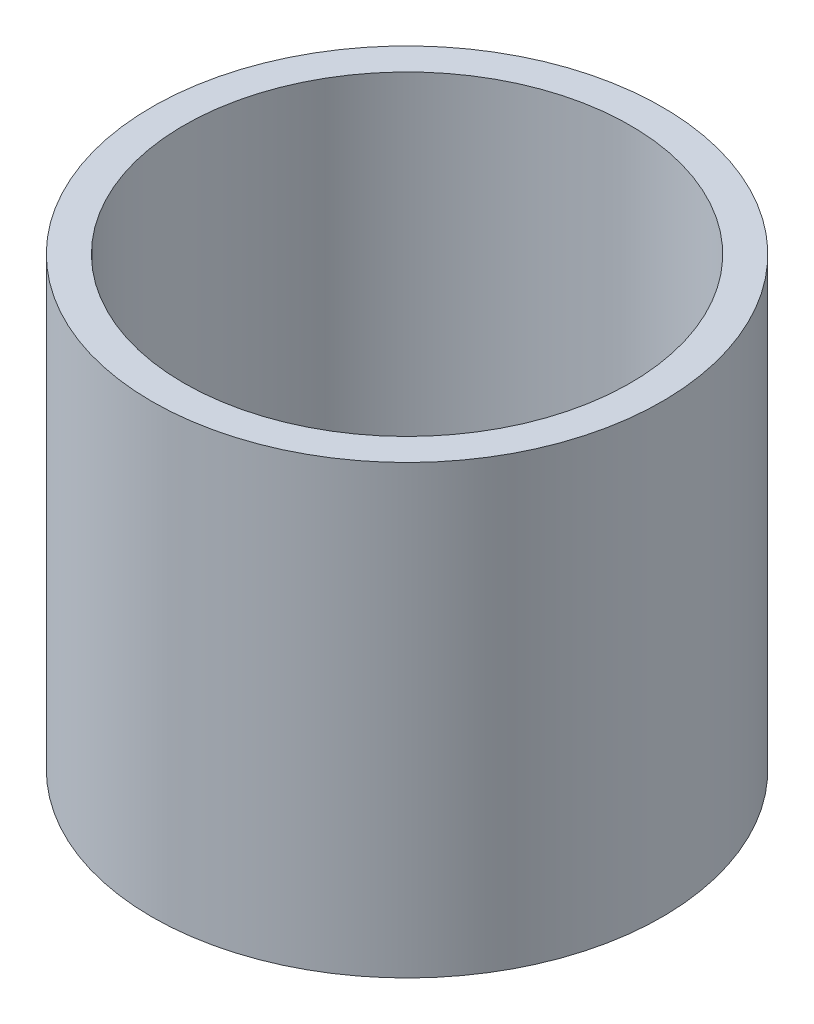
ISO-10303-21;
HEADER;
FILE_DESCRIPTION(('STEP AP214'),'2;1');
FILE_NAME('part.step','',(''),(''),'','','');
FILE_SCHEMA(('AUTOMOTIVE_DESIGN { 1 0 10303 214 1 1 1 1 }'));
ENDSEC;
DATA;
#1=APPLICATION_CONTEXT('core data for automotive mechanical design processes');
#2=APPLICATION_PROTOCOL_DEFINITION('international standard','automotive_design',2000,#1);
#3=PRODUCT_CONTEXT('',#1,'mechanical');
#4=PRODUCT('Part','Part','',(#3));
#5=PRODUCT_RELATED_PRODUCT_CATEGORY('part','',(#4));
#6=PRODUCT_DEFINITION_FORMATION('','',#4);
#7=PRODUCT_DEFINITION_CONTEXT('part definition',#1,'design');
#8=PRODUCT_DEFINITION('design','',#6,#7);
#9=PRODUCT_DEFINITION_SHAPE('','',#8);
#10=(LENGTH_UNIT() NAMED_UNIT(*) SI_UNIT(.MILLI.,.METRE.));
#11=(NAMED_UNIT(*) PLANE_ANGLE_UNIT() SI_UNIT($,.RADIAN.));
#12=(NAMED_UNIT(*) SI_UNIT($,.STERADIAN.) SOLID_ANGLE_UNIT());
#13=UNCERTAINTY_MEASURE_WITH_UNIT(LENGTH_MEASURE(1.E-05),#10,'distance_accuracy_value','');
#14=(GEOMETRIC_REPRESENTATION_CONTEXT(3) GLOBAL_UNCERTAINTY_ASSIGNED_CONTEXT((#13)) GLOBAL_UNIT_ASSIGNED_CONTEXT((#10,
#11,#12)) REPRESENTATION_CONTEXT('',''));
#15=CARTESIAN_POINT('',(0.,0.,0.));
#16=DIRECTION('',(0.,0.,1.));
#17=DIRECTION('',(1.,0.,0.));
#18=AXIS2_PLACEMENT_3D('',#15,#16,#17);
#19=CARTESIAN_POINT('',(0.,22.225,0.));
#20=DIRECTION('',(0.,1.,0.));
#21=DIRECTION('',(0.,0.,1.));
#22=AXIS2_PLACEMENT_3D('',#19,#20,#21);
#23=PLANE('',#22);
#24=CARTESIAN_POINT('',(0.,22.225,0.));
#25=DIRECTION('',(0.,1.,0.));
#26=DIRECTION('',(0.,0.,1.));
#27=AXIS2_PLACEMENT_3D('',#24,#25,#26);
#28=CIRCLE('',#27,12.7);
#29=CARTESIAN_POINT('',(0.,22.225,12.7));
#30=VERTEX_POINT('',#29);
#31=EDGE_CURVE('E10',#30,#30,#28,.T.);
#32=ORIENTED_EDGE('',*,*,#31,.T.);
#33=EDGE_LOOP('',(#32));
#34=FACE_BOUND('',#33,.T.);
#35=CARTESIAN_POINT('',(0.,22.225,0.));
#36=DIRECTION('',(0.,1.,0.));
#37=DIRECTION('',(0.,0.,1.));
#38=AXIS2_PLACEMENT_3D('',#35,#36,#37);
#39=CIRCLE('',#38,11.1125);
#40=CARTESIAN_POINT('',(0.,22.225,11.1125));
#41=VERTEX_POINT('',#40);
#42=EDGE_CURVE('E56',#41,#41,#39,.T.);
#43=ORIENTED_EDGE('',*,*,#42,.F.);
#44=EDGE_LOOP('',(#43));
#45=FACE_BOUND('',#44,.T.);
#46=ADVANCED_FACE('F43',(#34,#45),#23,.T.);
#47=CARTESIAN_POINT('',(0.,0.,0.));
#48=DIRECTION('',(0.,1.,0.));
#49=DIRECTION('',(0.,0.,1.));
#50=AXIS2_PLACEMENT_3D('',#47,#48,#49);
#51=PLANE('',#50);
#52=CARTESIAN_POINT('',(0.,0.,0.));
#53=DIRECTION('',(0.,1.,0.));
#54=DIRECTION('',(0.,0.,1.));
#55=AXIS2_PLACEMENT_3D('',#52,#53,#54);
#56=CIRCLE('',#55,12.7);
#57=CARTESIAN_POINT('',(0.,0.,12.7));
#58=VERTEX_POINT('',#57);
#59=EDGE_CURVE('E47',#58,#58,#56,.T.);
#60=ORIENTED_EDGE('',*,*,#59,.F.);
#61=EDGE_LOOP('',(#60));
#62=FACE_BOUND('',#61,.T.);
#63=CARTESIAN_POINT('',(0.,0.,0.));
#64=DIRECTION('',(0.,1.,0.));
#65=DIRECTION('',(0.,0.,1.));
#66=AXIS2_PLACEMENT_3D('',#63,#64,#65);
#67=CIRCLE('',#66,11.1125);
#68=CARTESIAN_POINT('',(0.,0.,11.1125));
#69=VERTEX_POINT('',#68);
#70=EDGE_CURVE('E58',#69,#69,#67,.T.);
#71=ORIENTED_EDGE('',*,*,#70,.T.);
#72=EDGE_LOOP('',(#71));
#73=FACE_BOUND('',#72,.T.);
#74=ADVANCED_FACE('F70',(#62,#73),#51,.F.);
#75=CARTESIAN_POINT('',(0.,22.225,0.));
#76=DIRECTION('',(0.,-1.,0.));
#77=DIRECTION('',(0.,0.,-1.));
#78=AXIS2_PLACEMENT_3D('',#75,#76,#77);
#79=CYLINDRICAL_SURFACE('',#78,12.7);
#80=ORIENTED_EDGE('',*,*,#31,.F.);
#81=EDGE_LOOP('',(#80));
#82=FACE_BOUND('',#81,.T.);
#83=ORIENTED_EDGE('',*,*,#59,.T.);
#84=EDGE_LOOP('',(#83));
#85=FACE_BOUND('',#84,.T.);
#86=ADVANCED_FACE('F45',(#82,#85),#79,.T.);
#87=CARTESIAN_POINT('',(0.,22.225,0.));
#88=DIRECTION('',(0.,-1.,0.));
#89=DIRECTION('',(0.,0.,-1.));
#90=AXIS2_PLACEMENT_3D('',#87,#88,#89);
#91=CYLINDRICAL_SURFACE('',#90,11.1125);
#92=ORIENTED_EDGE('',*,*,#42,.T.);
#93=EDGE_LOOP('',(#92));
#94=FACE_BOUND('',#93,.T.);
#95=ORIENTED_EDGE('',*,*,#70,.F.);
#96=EDGE_LOOP('',(#95));
#97=FACE_BOUND('',#96,.T.);
#98=ADVANCED_FACE('F66',(#94,#97),#91,.F.);
#99=CLOSED_SHELL('',(#46,#74,#86,#98));
#100=MANIFOLD_SOLID_BREP('B2',#99);
#101=ADVANCED_BREP_SHAPE_REPRESENTATION('',(#18,#100),#14);
#102=SHAPE_DEFINITION_REPRESENTATION(#9,#101);
ENDSEC;
END-ISO-10303-21;
